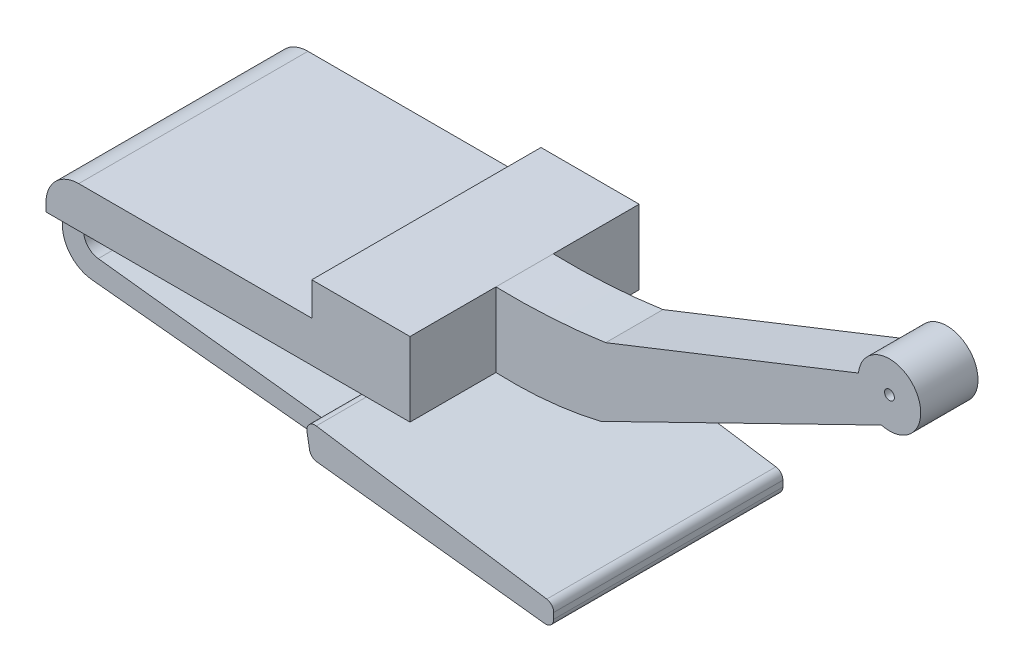
ISO-10303-21;
HEADER;
FILE_DESCRIPTION(('STEP AP214'),'2;1');
FILE_NAME('part.step','',(''),(''),'','','');
FILE_SCHEMA(('AUTOMOTIVE_DESIGN { 1 0 10303 214 1 1 1 1 }'));
ENDSEC;
DATA;
#1=APPLICATION_CONTEXT('core data for automotive mechanical design processes');
#2=APPLICATION_PROTOCOL_DEFINITION('international standard','automotive_design',2000,#1);
#3=PRODUCT_CONTEXT('',#1,'mechanical');
#4=PRODUCT('Part','Part','',(#3));
#5=PRODUCT_RELATED_PRODUCT_CATEGORY('part','',(#4));
#6=PRODUCT_DEFINITION_FORMATION('','',#4);
#7=PRODUCT_DEFINITION_CONTEXT('part definition',#1,'design');
#8=PRODUCT_DEFINITION('design','',#6,#7);
#9=PRODUCT_DEFINITION_SHAPE('','',#8);
#10=(LENGTH_UNIT() NAMED_UNIT(*) SI_UNIT(.MILLI.,.METRE.));
#11=(NAMED_UNIT(*) PLANE_ANGLE_UNIT() SI_UNIT($,.RADIAN.));
#12=(NAMED_UNIT(*) SI_UNIT($,.STERADIAN.) SOLID_ANGLE_UNIT());
#13=UNCERTAINTY_MEASURE_WITH_UNIT(LENGTH_MEASURE(1.E-05),#10,'distance_accuracy_value','');
#14=(GEOMETRIC_REPRESENTATION_CONTEXT(3) GLOBAL_UNCERTAINTY_ASSIGNED_CONTEXT((#13)) GLOBAL_UNIT_ASSIGNED_CONTEXT((#10,
#11,#12)) REPRESENTATION_CONTEXT('',''));
#15=CARTESIAN_POINT('',(0.,0.,0.));
#16=DIRECTION('',(0.,0.,1.));
#17=DIRECTION('',(1.,0.,0.));
#18=AXIS2_PLACEMENT_3D('',#15,#16,#17);
#19=CARTESIAN_POINT('',(9.1764705882353,3.85294117647059,7.));
#20=DIRECTION('',(-1.,0.,0.));
#21=DIRECTION('',(0.,0.,1.));
#22=AXIS2_PLACEMENT_3D('',#19,#20,#21);
#23=PLANE('',#22);
#24=DIRECTION('',(0.,-1.,0.));
#25=VECTOR('',#24,1.);
#26=CARTESIAN_POINT('',(9.1764705882353,8.38235294117648,1.75));
#27=LINE('',#26,#25);
#28=CARTESIAN_POINT('',(9.1764705882353,8.38235294117648,1.75));
#29=VERTEX_POINT('',#28);
#30=CARTESIAN_POINT('',(9.1764705882353,3.85294117647059,1.75));
#31=VERTEX_POINT('',#30);
#32=EDGE_CURVE('E246',#29,#31,#27,.T.);
#33=ORIENTED_EDGE('',*,*,#32,.F.);
#34=DIRECTION('',(0.,0.,-1.));
#35=VECTOR('',#34,1.);
#36=CARTESIAN_POINT('',(9.1764705882353,8.38235294117648,7.));
#37=LINE('',#36,#35);
#38=CARTESIAN_POINT('',(9.1764705882353,8.38235294117648,7.));
#39=VERTEX_POINT('',#38);
#40=EDGE_CURVE('E465',#39,#29,#37,.T.);
#41=ORIENTED_EDGE('',*,*,#40,.F.);
#42=DIRECTION('',(0.,1.,0.));
#43=VECTOR('',#42,1.);
#44=CARTESIAN_POINT('',(9.1764705882353,3.85294117647059,7.));
#45=LINE('',#44,#43);
#46=CARTESIAN_POINT('',(9.1764705882353,3.85294117647059,7.));
#47=VERTEX_POINT('',#46);
#48=EDGE_CURVE('E248',#47,#39,#45,.T.);
#49=ORIENTED_EDGE('',*,*,#48,.F.);
#50=DIRECTION('',(0.,0.,-1.));
#51=VECTOR('',#50,1.);
#52=CARTESIAN_POINT('',(9.1764705882353,3.85294117647059,7.));
#53=LINE('',#52,#51);
#54=EDGE_CURVE('E242',#47,#31,#53,.T.);
#55=ORIENTED_EDGE('',*,*,#54,.T.);
#56=EDGE_LOOP('',(#33,#41,#49,#55));
#57=FACE_BOUND('',#56,.T.);
#58=ADVANCED_FACE('F37',(#57),#23,.F.);
#59=CARTESIAN_POINT('',(-11.2605255667113,0.670651598769307,6.));
#60=DIRECTION('',(0.100851018649792,0.99490153886568,0.));
#61=DIRECTION('',(-0.994901538865681,0.100851018649792,0.));
#62=AXIS2_PLACEMENT_3D('',#59,#60,#61);
#63=PLANE('',#62);
#64=DIRECTION('',(0.,0.,-1.));
#65=VECTOR('',#64,1.);
#66=CARTESIAN_POINT('',(3.06996879819847,-0.781999641577588,7.));
#67=LINE('',#66,#65);
#68=CARTESIAN_POINT('',(3.06996879819847,-0.781999641577588,6.));
#69=VERTEX_POINT('',#68);
#70=CARTESIAN_POINT('',(3.06996879819847,-0.781999641577588,-6.));
#71=VERTEX_POINT('',#70);
#72=EDGE_CURVE('E432',#69,#71,#67,.T.);
#73=ORIENTED_EDGE('',*,*,#72,.F.);
#74=DIRECTION('',(0.994901538865681,-0.100851018649792,0.));
#75=VECTOR('',#74,1.);
#76=CARTESIAN_POINT('',(-11.2605255667113,0.670651598769307,6.));
#77=LINE('',#76,#75);
#78=CARTESIAN_POINT('',(-11.2605255667113,0.670651598769306,6.));
#79=VERTEX_POINT('',#78);
#80=EDGE_CURVE('E439',#79,#69,#77,.T.);
#81=ORIENTED_EDGE('',*,*,#80,.F.);
#82=DIRECTION('',(0.,0.,-1.));
#83=VECTOR('',#82,1.);
#84=CARTESIAN_POINT('',(-11.2605255667113,0.670651598769306,6.));
#85=LINE('',#84,#83);
#86=CARTESIAN_POINT('',(-11.2605255667113,0.670651598769306,-6.));
#87=VERTEX_POINT('',#86);
#88=EDGE_CURVE('E499',#79,#87,#85,.T.);
#89=ORIENTED_EDGE('',*,*,#88,.T.);
#90=DIRECTION('',(0.994901538865681,-0.100851018649792,0.));
#91=VECTOR('',#90,1.);
#92=CARTESIAN_POINT('',(-11.2605255667113,0.670651598769307,-6.));
#93=LINE('',#92,#91);
#94=EDGE_CURVE('E530',#87,#71,#93,.T.);
#95=ORIENTED_EDGE('',*,*,#94,.T.);
#96=EDGE_LOOP('',(#73,#81,#89,#95));
#97=FACE_BOUND('',#96,.T.);
#98=ADVANCED_FACE('F607',(#97),#63,.F.);
#99=CARTESIAN_POINT('',(3.07281024128905,0.357643738801673,6.));
#100=DIRECTION('',(-0.115751075665273,-0.993278253301829,0.));
#101=DIRECTION('',(0.993278253301829,-0.115751075665273,0.));
#102=AXIS2_PLACEMENT_3D('',#99,#100,#101);
#103=PLANE('',#102);
#104=DIRECTION('',(0.,0.,-1.));
#105=VECTOR('',#104,1.);
#106=CARTESIAN_POINT('',(2.88284537780646,0.379781178349577,7.));
#107=LINE('',#106,#105);
#108=CARTESIAN_POINT('',(2.88284537780646,0.379781178349577,-6.));
#109=VERTEX_POINT('',#108);
#110=CARTESIAN_POINT('',(2.88284537780646,0.379781178349577,6.));
#111=VERTEX_POINT('',#110);
#112=EDGE_CURVE('E428',#109,#111,#107,.F.);
#113=ORIENTED_EDGE('',*,*,#112,.F.);
#114=DIRECTION('',(-0.993278253301829,0.115751075665273,0.));
#115=VECTOR('',#114,1.);
#116=CARTESIAN_POINT('',(3.07281024128905,0.357643738801673,-6.));
#117=LINE('',#116,#115);
#118=CARTESIAN_POINT('',(-10.8683215416007,1.98226503147227,-6.));
#119=VERTEX_POINT('',#118);
#120=EDGE_CURVE('E536',#109,#119,#117,.T.);
#121=ORIENTED_EDGE('',*,*,#120,.T.);
#122=DIRECTION('',(0.,0.,-1.));
#123=VECTOR('',#122,1.);
#124=CARTESIAN_POINT('',(-10.8683215416007,1.98226503147227,6.));
#125=LINE('',#124,#123);
#126=CARTESIAN_POINT('',(-10.8683215416007,1.98226503147227,6.));
#127=VERTEX_POINT('',#126);
#128=EDGE_CURVE('E550',#127,#119,#125,.T.);
#129=ORIENTED_EDGE('',*,*,#128,.F.);
#130=DIRECTION('',(-0.993278253301829,0.115751075665273,0.));
#131=VECTOR('',#130,1.);
#132=CARTESIAN_POINT('',(3.07281024128905,0.357643738801673,6.));
#133=LINE('',#132,#131);
#134=EDGE_CURVE('E443',#111,#127,#133,.T.);
#135=ORIENTED_EDGE('',*,*,#134,.F.);
#136=EDGE_LOOP('',(#113,#121,#129,#135));
#137=FACE_BOUND('',#136,.T.);
#138=ADVANCED_FACE('F611',(#137),#103,.F.);
#139=CARTESIAN_POINT('',(-10.7525704659354,2.9755432847741,6.));
#140=DIRECTION('',(0.,0.,-1.));
#141=DIRECTION('',(-1.,0.,0.));
#142=AXIS2_PLACEMENT_3D('',#139,#140,#141);
#143=PLANE('',#142);
#144=CARTESIAN_POINT('',(3.53426539442417,-0.596449996648719,6.));
#145=DIRECTION('',(0.,0.,-1.));
#146=DIRECTION('',(-1.,0.,0.));
#147=AXIS2_PLACEMENT_3D('',#144,#145,#146);
#148=CIRCLE('',#147,0.5);
#149=CARTESIAN_POINT('',(3.04205160666993,-0.684345315890544,6.));
#150=VERTEX_POINT('',#149);
#151=EDGE_CURVE('E434',#150,#69,#148,.F.);
#152=ORIENTED_EDGE('',*,*,#151,.F.);
#153=DIRECTION('',(0.175790638483657,-0.984427575508482,0.));
#154=VECTOR('',#153,1.);
#155=CARTESIAN_POINT('',(1.98241012841508,5.24964696233667,6.));
#156=LINE('',#155,#154);
#157=CARTESIAN_POINT('',(2.88313142094607,0.205607724163092,6.));
#158=VERTEX_POINT('',#157);
#159=EDGE_CURVE('E426',#158,#150,#156,.T.);
#160=ORIENTED_EDGE('',*,*,#159,.F.);
#161=CARTESIAN_POINT('',(3.37534520870031,0.293503043404926,6.));
#162=DIRECTION('',(0.,0.,-1.));
#163=DIRECTION('',(-1.,0.,0.));
#164=AXIS2_PLACEMENT_3D('',#161,#162,#163);
#165=CIRCLE('',#164,0.5);
#166=EDGE_CURVE('E430',#111,#158,#165,.F.);
#167=ORIENTED_EDGE('',*,*,#166,.F.);
#168=ORIENTED_EDGE('',*,*,#134,.T.);
#169=CARTESIAN_POINT('',(-10.7525704659354,2.9755432847741,6.));
#170=DIRECTION('',(0.,0.,-1.));
#171=DIRECTION('',(-1.,0.,0.));
#172=AXIS2_PLACEMENT_3D('',#169,#170,#171);
#173=CIRCLE('',#172,1.);
#174=CARTESIAN_POINT('',(-11.7525704659354,2.97554328477411,6.));
#175=VERTEX_POINT('',#174);
#176=EDGE_CURVE('E445',#127,#175,#173,.T.);
#177=ORIENTED_EDGE('',*,*,#176,.T.);
#178=DIRECTION('',(0.,1.,0.));
#179=VECTOR('',#178,1.);
#180=CARTESIAN_POINT('',(-11.7525704659354,2.97554328477411,6.));
#181=LINE('',#180,#179);
#182=CARTESIAN_POINT('',(-11.7525704659354,3.85294117647059,6.));
#183=VERTEX_POINT('',#182);
#184=EDGE_CURVE('E447',#175,#183,#181,.T.);
#185=ORIENTED_EDGE('',*,*,#184,.T.);
#186=DIRECTION('',(-1.,0.,0.));
#187=VECTOR('',#186,1.);
#188=CARTESIAN_POINT('',(-13.0588235294118,3.85294117647059,6.));
#189=LINE('',#188,#187);
#190=CARTESIAN_POINT('',(-13.0588235294118,3.85294117647059,6.));
#191=VERTEX_POINT('',#190);
#192=EDGE_CURVE('E521',#183,#191,#189,.T.);
#193=ORIENTED_EDGE('',*,*,#192,.T.);
#194=DIRECTION('',(0.,-1.,0.));
#195=VECTOR('',#194,1.);
#196=CARTESIAN_POINT('',(-13.0588235294118,3.85294117647059,6.));
#197=LINE('',#196,#195);
#198=CARTESIAN_POINT('',(-13.0588235294118,2.66045467650068,6.));
#199=VERTEX_POINT('',#198);
#200=EDGE_CURVE('E440',#191,#199,#197,.T.);
#201=ORIENTED_EDGE('',*,*,#200,.T.);
#202=CARTESIAN_POINT('',(-11.0588235294118,2.66045467650067,6.));
#203=DIRECTION('',(0.,0.,1.));
#204=DIRECTION('',(-1.,0.,0.));
#205=AXIS2_PLACEMENT_3D('',#202,#203,#204);
#206=CIRCLE('',#205,2.);
#207=EDGE_CURVE('E437',#199,#79,#206,.T.);
#208=ORIENTED_EDGE('',*,*,#207,.T.);
#209=ORIENTED_EDGE('',*,*,#80,.T.);
#210=EDGE_LOOP('',(#152,#160,#167,#168,#177,#185,#193,#201,#208,#209));
#211=FACE_BOUND('',#210,.T.);
#212=ADVANCED_FACE('F624',(#211),#143,.F.);
#213=CARTESIAN_POINT('',(-10.7525704659354,2.9755432847741,-6.));
#214=DIRECTION('',(0.,0.,-1.));
#215=DIRECTION('',(-1.,0.,0.));
#216=AXIS2_PLACEMENT_3D('',#213,#214,#215);
#217=PLANE('',#216);
#218=DIRECTION('',(0.175790638483657,-0.984427575508482,0.));
#219=VECTOR('',#218,1.);
#220=CARTESIAN_POINT('',(1.98241012841508,5.24964696233667,-6.));
#221=LINE('',#220,#219);
#222=CARTESIAN_POINT('',(2.88313142094607,0.205607724163092,-6.));
#223=VERTEX_POINT('',#222);
#224=CARTESIAN_POINT('',(3.04205160666993,-0.684345315890545,-6.));
#225=VERTEX_POINT('',#224);
#226=EDGE_CURVE('E252',#223,#225,#221,.T.);
#227=ORIENTED_EDGE('',*,*,#226,.T.);
#228=CARTESIAN_POINT('',(3.53426539442417,-0.596449996648719,-6.));
#229=DIRECTION('',(0.,0.,-1.));
#230=DIRECTION('',(-1.,0.,0.));
#231=AXIS2_PLACEMENT_3D('',#228,#229,#230);
#232=CIRCLE('',#231,0.5);
#233=EDGE_CURVE('E11',#225,#71,#232,.F.);
#234=ORIENTED_EDGE('',*,*,#233,.T.);
#235=ORIENTED_EDGE('',*,*,#94,.F.);
#236=CARTESIAN_POINT('',(-11.0588235294118,2.66045467650067,-6.));
#237=DIRECTION('',(0.,0.,1.));
#238=DIRECTION('',(-1.,0.,0.));
#239=AXIS2_PLACEMENT_3D('',#236,#237,#238);
#240=CIRCLE('',#239,2.);
#241=CARTESIAN_POINT('',(-13.0588235294118,2.66045467650068,-6.));
#242=VERTEX_POINT('',#241);
#243=EDGE_CURVE('E452',#242,#87,#240,.T.);
#244=ORIENTED_EDGE('',*,*,#243,.F.);
#245=DIRECTION('',(0.,-1.,0.));
#246=VECTOR('',#245,1.);
#247=CARTESIAN_POINT('',(-13.0588235294118,3.85294117647059,-6.));
#248=LINE('',#247,#246);
#249=CARTESIAN_POINT('',(-13.0588235294118,3.85294117647059,-6.));
#250=VERTEX_POINT('',#249);
#251=EDGE_CURVE('E458',#250,#242,#248,.T.);
#252=ORIENTED_EDGE('',*,*,#251,.F.);
#253=DIRECTION('',(-1.,0.,0.));
#254=VECTOR('',#253,1.);
#255=CARTESIAN_POINT('',(-13.0588235294118,3.85294117647059,-6.));
#256=LINE('',#255,#254);
#257=CARTESIAN_POINT('',(-11.7525704659354,3.85294117647059,-6.));
#258=VERTEX_POINT('',#257);
#259=EDGE_CURVE('E436',#258,#250,#256,.T.);
#260=ORIENTED_EDGE('',*,*,#259,.F.);
#261=DIRECTION('',(0.,1.,0.));
#262=VECTOR('',#261,1.);
#263=CARTESIAN_POINT('',(-11.7525704659354,2.97554328477411,-6.));
#264=LINE('',#263,#262);
#265=CARTESIAN_POINT('',(-11.7525704659354,2.97554328477411,-6.));
#266=VERTEX_POINT('',#265);
#267=EDGE_CURVE('E526',#266,#258,#264,.T.);
#268=ORIENTED_EDGE('',*,*,#267,.F.);
#269=CARTESIAN_POINT('',(-10.7525704659354,2.9755432847741,-6.));
#270=DIRECTION('',(0.,0.,-1.));
#271=DIRECTION('',(-1.,0.,0.));
#272=AXIS2_PLACEMENT_3D('',#269,#270,#271);
#273=CIRCLE('',#272,1.);
#274=EDGE_CURVE('E540',#119,#266,#273,.T.);
#275=ORIENTED_EDGE('',*,*,#274,.F.);
#276=ORIENTED_EDGE('',*,*,#120,.F.);
#277=CARTESIAN_POINT('',(3.37534520870031,0.293503043404926,-6.));
#278=DIRECTION('',(0.,0.,-1.));
#279=DIRECTION('',(-1.,0.,0.));
#280=AXIS2_PLACEMENT_3D('',#277,#278,#279);
#281=CIRCLE('',#280,0.5);
#282=EDGE_CURVE('E48',#109,#223,#281,.F.);
#283=ORIENTED_EDGE('',*,*,#282,.T.);
#284=EDGE_LOOP('',(#227,#234,#235,#244,#252,#260,#268,#275,#276,#283));
#285=FACE_BOUND('',#284,.T.);
#286=ADVANCED_FACE('F620',(#285),#217,.T.);
#287=CARTESIAN_POINT('',(-13.0588235294118,3.85294117647059,7.));
#288=DIRECTION('',(0.,1.,0.));
#289=DIRECTION('',(0.,0.,1.));
#290=AXIS2_PLACEMENT_3D('',#287,#288,#289);
#291=PLANE('',#290);
#292=DIRECTION('',(0.,0.,-1.));
#293=VECTOR('',#292,1.);
#294=CARTESIAN_POINT('',(-11.7525704659354,3.85294117647059,6.));
#295=LINE('',#294,#293);
#296=EDGE_CURVE('E449',#183,#258,#295,.T.);
#297=ORIENTED_EDGE('',*,*,#296,.T.);
#298=ORIENTED_EDGE('',*,*,#259,.T.);
#299=DIRECTION('',(0.,0.,-1.));
#300=VECTOR('',#299,1.);
#301=CARTESIAN_POINT('',(-13.0588235294118,3.85294117647059,7.));
#302=LINE('',#301,#300);
#303=CARTESIAN_POINT('',(-13.0588235294118,3.85294117647059,-7.));
#304=VERTEX_POINT('',#303);
#305=EDGE_CURVE('E494',#250,#304,#302,.T.);
#306=ORIENTED_EDGE('',*,*,#305,.T.);
#307=DIRECTION('',(1.,0.,0.));
#308=VECTOR('',#307,1.);
#309=CARTESIAN_POINT('',(-13.0588235294118,3.85294117647059,-7.));
#310=LINE('',#309,#308);
#311=CARTESIAN_POINT('',(9.1764705882353,3.85294117647059,-7.));
#312=VERTEX_POINT('',#311);
#313=EDGE_CURVE('E489',#304,#312,#310,.T.);
#314=ORIENTED_EDGE('',*,*,#313,.T.);
#315=CARTESIAN_POINT('',(9.1764705882353,3.85294117647059,-1.75));
#316=VERTEX_POINT('',#315);
#317=EDGE_CURVE('E253',#316,#312,#53,.T.);
#318=ORIENTED_EDGE('',*,*,#317,.F.);
#319=DIRECTION('',(0.,0.,-1.));
#320=VECTOR('',#319,1.);
#321=CARTESIAN_POINT('',(9.1764705882353,3.85294117647059,1.75));
#322=LINE('',#321,#320);
#323=EDGE_CURVE('E256',#31,#316,#322,.T.);
#324=ORIENTED_EDGE('',*,*,#323,.F.);
#325=ORIENTED_EDGE('',*,*,#54,.F.);
#326=DIRECTION('',(1.,0.,0.));
#327=VECTOR('',#326,1.);
#328=CARTESIAN_POINT('',(-13.0588235294118,3.85294117647059,7.));
#329=LINE('',#328,#327);
#330=CARTESIAN_POINT('',(-13.0588235294118,3.85294117647059,7.));
#331=VERTEX_POINT('',#330);
#332=EDGE_CURVE('E513',#331,#47,#329,.T.);
#333=ORIENTED_EDGE('',*,*,#332,.F.);
#334=EDGE_CURVE('E476',#331,#191,#302,.T.);
#335=ORIENTED_EDGE('',*,*,#334,.T.);
#336=ORIENTED_EDGE('',*,*,#192,.F.);
#337=EDGE_LOOP('',(#297,#298,#306,#314,#318,#324,#325,#333,#335,#336));
#338=FACE_BOUND('',#337,.T.);
#339=ADVANCED_FACE('F39',(#338),#291,.F.);
#340=CARTESIAN_POINT('',(9.1764705882353,8.38235294117648,-1.75));
#341=VERTEX_POINT('',#340);
#342=CARTESIAN_POINT('',(9.1764705882353,8.38235294117648,-7.));
#343=VERTEX_POINT('',#342);
#344=EDGE_CURVE('E61',#341,#343,#37,.T.);
#345=ORIENTED_EDGE('',*,*,#344,.F.);
#346=DIRECTION('',(0.,-1.,0.));
#347=VECTOR('',#346,1.);
#348=CARTESIAN_POINT('',(9.1764705882353,8.38235294117648,-1.75));
#349=LINE('',#348,#347);
#350=EDGE_CURVE('E56',#341,#316,#349,.T.);
#351=ORIENTED_EDGE('',*,*,#350,.T.);
#352=ORIENTED_EDGE('',*,*,#317,.T.);
#353=DIRECTION('',(0.,1.,0.));
#354=VECTOR('',#353,1.);
#355=CARTESIAN_POINT('',(9.1764705882353,3.85294117647059,-7.));
#356=LINE('',#355,#354);
#357=EDGE_CURVE('E483',#312,#343,#356,.T.);
#358=ORIENTED_EDGE('',*,*,#357,.T.);
#359=EDGE_LOOP('',(#345,#351,#352,#358));
#360=FACE_BOUND('',#359,.T.);
#361=ADVANCED_FACE('F482',(#360),#23,.F.);
#362=CARTESIAN_POINT('',(9.1764705882353,8.38235294117648,7.));
#363=DIRECTION('',(0.,-1.,0.));
#364=DIRECTION('',(0.,0.,-1.));
#365=AXIS2_PLACEMENT_3D('',#362,#363,#364);
#366=PLANE('',#365);
#367=DIRECTION('',(-1.,0.,0.));
#368=VECTOR('',#367,1.);
#369=CARTESIAN_POINT('',(9.1764705882353,8.38235294117648,-7.));
#370=LINE('',#369,#368);
#371=CARTESIAN_POINT('',(3.1764705882353,8.38235294117648,-7.));
#372=VERTEX_POINT('',#371);
#373=EDGE_CURVE('E491',#343,#372,#370,.T.);
#374=ORIENTED_EDGE('',*,*,#373,.T.);
#375=DIRECTION('',(0.,0.,-1.));
#376=VECTOR('',#375,1.);
#377=CARTESIAN_POINT('',(3.1764705882353,8.38235294117648,7.));
#378=LINE('',#377,#376);
#379=CARTESIAN_POINT('',(3.1764705882353,8.38235294117648,7.));
#380=VERTEX_POINT('',#379);
#381=EDGE_CURVE('E471',#380,#372,#378,.T.);
#382=ORIENTED_EDGE('',*,*,#381,.F.);
#383=DIRECTION('',(-1.,0.,0.));
#384=VECTOR('',#383,1.);
#385=CARTESIAN_POINT('',(9.1764705882353,8.38235294117648,7.));
#386=LINE('',#385,#384);
#387=EDGE_CURVE('E556',#39,#380,#386,.T.);
#388=ORIENTED_EDGE('',*,*,#387,.F.);
#389=ORIENTED_EDGE('',*,*,#40,.T.);
#390=DIRECTION('',(0.,0.,-1.));
#391=VECTOR('',#390,1.);
#392=CARTESIAN_POINT('',(9.1764705882353,8.38235294117648,1.75));
#393=LINE('',#392,#391);
#394=EDGE_CURVE('E262',#29,#341,#393,.T.);
#395=ORIENTED_EDGE('',*,*,#394,.T.);
#396=ORIENTED_EDGE('',*,*,#344,.T.);
#397=EDGE_LOOP('',(#374,#382,#388,#389,#395,#396));
#398=FACE_BOUND('',#397,.T.);
#399=ADVANCED_FACE('F588',(#398),#366,.F.);
#400=CARTESIAN_POINT('',(3.1764705882353,8.38235294117648,7.));
#401=DIRECTION('',(1.,0.,0.));
#402=DIRECTION('',(0.,0.,-1.));
#403=AXIS2_PLACEMENT_3D('',#400,#401,#402);
#404=PLANE('',#403);
#405=DIRECTION('',(0.,-1.,0.));
#406=VECTOR('',#405,1.);
#407=CARTESIAN_POINT('',(3.1764705882353,8.38235294117648,-7.));
#408=LINE('',#407,#406);
#409=CARTESIAN_POINT('',(3.1764705882353,6.35294117647059,-7.));
#410=VERTEX_POINT('',#409);
#411=EDGE_CURVE('E506',#372,#410,#408,.T.);
#412=ORIENTED_EDGE('',*,*,#411,.T.);
#413=DIRECTION('',(0.,0.,-1.));
#414=VECTOR('',#413,1.);
#415=CARTESIAN_POINT('',(3.1764705882353,6.35294117647059,7.));
#416=LINE('',#415,#414);
#417=CARTESIAN_POINT('',(3.1764705882353,6.35294117647059,7.));
#418=VERTEX_POINT('',#417);
#419=EDGE_CURVE('E574',#418,#410,#416,.T.);
#420=ORIENTED_EDGE('',*,*,#419,.F.);
#421=DIRECTION('',(0.,-1.,0.));
#422=VECTOR('',#421,1.);
#423=CARTESIAN_POINT('',(3.1764705882353,8.38235294117648,7.));
#424=LINE('',#423,#422);
#425=EDGE_CURVE('E558',#380,#418,#424,.T.);
#426=ORIENTED_EDGE('',*,*,#425,.F.);
#427=ORIENTED_EDGE('',*,*,#381,.T.);
#428=EDGE_LOOP('',(#412,#420,#426,#427));
#429=FACE_BOUND('',#428,.T.);
#430=ADVANCED_FACE('F619',(#429),#404,.F.);
#431=CARTESIAN_POINT('',(3.1764705882353,6.35294117647059,7.));
#432=DIRECTION('',(0.,-1.,0.));
#433=DIRECTION('',(0.,0.,-1.));
#434=AXIS2_PLACEMENT_3D('',#431,#432,#433);
#435=PLANE('',#434);
#436=DIRECTION('',(-1.,0.,0.));
#437=VECTOR('',#436,1.);
#438=CARTESIAN_POINT('',(3.1764705882353,6.35294117647059,-7.));
#439=LINE('',#438,#437);
#440=CARTESIAN_POINT('',(-11.0588235294117,6.35294117647059,-7.));
#441=VERTEX_POINT('',#440);
#442=EDGE_CURVE('E508',#410,#441,#439,.T.);
#443=ORIENTED_EDGE('',*,*,#442,.T.);
#444=DIRECTION('',(0.,0.,-1.));
#445=VECTOR('',#444,1.);
#446=CARTESIAN_POINT('',(-11.0588235294117,6.35294117647059,7.));
#447=LINE('',#446,#445);
#448=CARTESIAN_POINT('',(-11.0588235294117,6.35294117647059,7.));
#449=VERTEX_POINT('',#448);
#450=EDGE_CURVE('E572',#449,#441,#447,.T.);
#451=ORIENTED_EDGE('',*,*,#450,.F.);
#452=DIRECTION('',(-1.,0.,0.));
#453=VECTOR('',#452,1.);
#454=CARTESIAN_POINT('',(3.1764705882353,6.35294117647059,7.));
#455=LINE('',#454,#453);
#456=EDGE_CURVE('E560',#418,#449,#455,.T.);
#457=ORIENTED_EDGE('',*,*,#456,.F.);
#458=ORIENTED_EDGE('',*,*,#419,.T.);
#459=EDGE_LOOP('',(#443,#451,#457,#458));
#460=FACE_BOUND('',#459,.T.);
#461=ADVANCED_FACE('F658',(#460),#435,.F.);
#462=CARTESIAN_POINT('',(-11.0588235294118,4.35294117647059,7.));
#463=DIRECTION('',(0.,0.,-1.));
#464=DIRECTION('',(-1.,0.,0.));
#465=AXIS2_PLACEMENT_3D('',#462,#463,#464);
#466=CYLINDRICAL_SURFACE('',#465,2.);
#467=CARTESIAN_POINT('',(-11.0588235294118,4.35294117647059,-7.));
#468=DIRECTION('',(0.,0.,1.));
#469=DIRECTION('',(-1.,0.,0.));
#470=AXIS2_PLACEMENT_3D('',#467,#468,#469);
#471=CIRCLE('',#470,2.);
#472=CARTESIAN_POINT('',(-13.0588235294118,4.35294117647058,-7.));
#473=VERTEX_POINT('',#472);
#474=EDGE_CURVE('E510',#441,#473,#471,.T.);
#475=ORIENTED_EDGE('',*,*,#474,.T.);
#476=DIRECTION('',(0.,0.,-1.));
#477=VECTOR('',#476,1.);
#478=CARTESIAN_POINT('',(-13.0588235294118,4.35294117647058,7.));
#479=LINE('',#478,#477);
#480=CARTESIAN_POINT('',(-13.0588235294118,4.35294117647058,7.));
#481=VERTEX_POINT('',#480);
#482=EDGE_CURVE('E516',#481,#473,#479,.T.);
#483=ORIENTED_EDGE('',*,*,#482,.F.);
#484=CARTESIAN_POINT('',(-11.0588235294118,4.35294117647059,7.));
#485=DIRECTION('',(0.,0.,1.));
#486=DIRECTION('',(-1.,0.,0.));
#487=AXIS2_PLACEMENT_3D('',#484,#485,#486);
#488=CIRCLE('',#487,2.);
#489=EDGE_CURVE('E561',#449,#481,#488,.T.);
#490=ORIENTED_EDGE('',*,*,#489,.F.);
#491=ORIENTED_EDGE('',*,*,#450,.T.);
#492=EDGE_LOOP('',(#475,#483,#490,#491));
#493=FACE_BOUND('',#492,.T.);
#494=ADVANCED_FACE('F655',(#493),#466,.T.);
#495=CARTESIAN_POINT('',(-13.0588235294118,4.35294117647058,7.));
#496=DIRECTION('',(1.,0.,0.));
#497=DIRECTION('',(0.,0.,-1.));
#498=AXIS2_PLACEMENT_3D('',#495,#496,#497);
#499=PLANE('',#498);
#500=DIRECTION('',(0.,-1.,0.));
#501=VECTOR('',#500,1.);
#502=CARTESIAN_POINT('',(-13.0588235294118,4.35294117647058,-7.));
#503=LINE('',#502,#501);
#504=EDGE_CURVE('E512',#473,#304,#503,.T.);
#505=ORIENTED_EDGE('',*,*,#504,.T.);
#506=ORIENTED_EDGE('',*,*,#305,.F.);
#507=ORIENTED_EDGE('',*,*,#251,.T.);
#508=DIRECTION('',(0.,0.,-1.));
#509=VECTOR('',#508,1.);
#510=CARTESIAN_POINT('',(-13.0588235294118,2.66045467650068,6.));
#511=LINE('',#510,#509);
#512=EDGE_CURVE('E496',#199,#242,#511,.T.);
#513=ORIENTED_EDGE('',*,*,#512,.F.);
#514=ORIENTED_EDGE('',*,*,#200,.F.);
#515=ORIENTED_EDGE('',*,*,#334,.F.);
#516=DIRECTION('',(0.,-1.,0.));
#517=VECTOR('',#516,1.);
#518=CARTESIAN_POINT('',(-13.0588235294118,4.35294117647058,7.));
#519=LINE('',#518,#517);
#520=EDGE_CURVE('E502',#481,#331,#519,.T.);
#521=ORIENTED_EDGE('',*,*,#520,.F.);
#522=ORIENTED_EDGE('',*,*,#482,.T.);
#523=EDGE_LOOP('',(#505,#506,#507,#513,#514,#515,#521,#522));
#524=FACE_BOUND('',#523,.T.);
#525=ADVANCED_FACE('F570',(#524),#499,.F.);
#526=CARTESIAN_POINT('',(-11.0588235294118,4.35294117647059,7.));
#527=DIRECTION('',(0.,0.,-1.));
#528=DIRECTION('',(-1.,0.,0.));
#529=AXIS2_PLACEMENT_3D('',#526,#527,#528);
#530=PLANE('',#529);
#531=ORIENTED_EDGE('',*,*,#332,.T.);
#532=ORIENTED_EDGE('',*,*,#48,.T.);
#533=ORIENTED_EDGE('',*,*,#387,.T.);
#534=ORIENTED_EDGE('',*,*,#425,.T.);
#535=ORIENTED_EDGE('',*,*,#456,.T.);
#536=ORIENTED_EDGE('',*,*,#489,.T.);
#537=ORIENTED_EDGE('',*,*,#520,.T.);
#538=EDGE_LOOP('',(#531,#532,#533,#534,#535,#536,#537));
#539=FACE_BOUND('',#538,.T.);
#540=ADVANCED_FACE('F567',(#539),#530,.F.);
#541=CARTESIAN_POINT('',(-11.0588235294118,4.35294117647059,-7.));
#542=DIRECTION('',(0.,0.,-1.));
#543=DIRECTION('',(-1.,0.,0.));
#544=AXIS2_PLACEMENT_3D('',#541,#542,#543);
#545=PLANE('',#544);
#546=ORIENTED_EDGE('',*,*,#313,.F.);
#547=ORIENTED_EDGE('',*,*,#504,.F.);
#548=ORIENTED_EDGE('',*,*,#474,.F.);
#549=ORIENTED_EDGE('',*,*,#442,.F.);
#550=ORIENTED_EDGE('',*,*,#411,.F.);
#551=ORIENTED_EDGE('',*,*,#373,.F.);
#552=ORIENTED_EDGE('',*,*,#357,.F.);
#553=EDGE_LOOP('',(#546,#547,#548,#549,#550,#551,#552));
#554=FACE_BOUND('',#553,.T.);
#555=ADVANCED_FACE('F487',(#554),#545,.T.);
#556=CARTESIAN_POINT('',(-11.0588235294118,2.66045467650067,6.));
#557=DIRECTION('',(0.,0.,-1.));
#558=DIRECTION('',(-1.,0.,0.));
#559=AXIS2_PLACEMENT_3D('',#556,#557,#558);
#560=CYLINDRICAL_SURFACE('',#559,2.);
#561=ORIENTED_EDGE('',*,*,#243,.T.);
#562=ORIENTED_EDGE('',*,*,#88,.F.);
#563=ORIENTED_EDGE('',*,*,#207,.F.);
#564=ORIENTED_EDGE('',*,*,#512,.T.);
#565=EDGE_LOOP('',(#561,#562,#563,#564));
#566=FACE_BOUND('',#565,.T.);
#567=ADVANCED_FACE('F642',(#566),#560,.T.);
#568=CARTESIAN_POINT('',(-10.7525704659354,2.9755432847741,6.));
#569=DIRECTION('',(0.,0.,-1.));
#570=DIRECTION('',(-1.,0.,0.));
#571=AXIS2_PLACEMENT_3D('',#568,#569,#570);
#572=CYLINDRICAL_SURFACE('',#571,1.);
#573=ORIENTED_EDGE('',*,*,#274,.T.);
#574=DIRECTION('',(0.,0.,-1.));
#575=VECTOR('',#574,1.);
#576=CARTESIAN_POINT('',(-11.7525704659354,2.97554328477411,6.));
#577=LINE('',#576,#575);
#578=EDGE_CURVE('E547',#175,#266,#577,.T.);
#579=ORIENTED_EDGE('',*,*,#578,.F.);
#580=ORIENTED_EDGE('',*,*,#176,.F.);
#581=ORIENTED_EDGE('',*,*,#128,.T.);
#582=EDGE_LOOP('',(#573,#579,#580,#581));
#583=FACE_BOUND('',#582,.T.);
#584=ADVANCED_FACE('F638',(#583),#572,.F.);
#585=CARTESIAN_POINT('',(-11.7525704659354,2.97554328477411,6.));
#586=DIRECTION('',(-1.,0.,0.));
#587=DIRECTION('',(0.,0.,1.));
#588=AXIS2_PLACEMENT_3D('',#585,#586,#587);
#589=PLANE('',#588);
#590=ORIENTED_EDGE('',*,*,#267,.T.);
#591=ORIENTED_EDGE('',*,*,#296,.F.);
#592=ORIENTED_EDGE('',*,*,#184,.F.);
#593=ORIENTED_EDGE('',*,*,#578,.T.);
#594=EDGE_LOOP('',(#590,#591,#592,#593));
#595=FACE_BOUND('',#594,.T.);
#596=ADVANCED_FACE('F634',(#595),#589,.F.);
#597=CARTESIAN_POINT('',(3.53426539442417,-0.596449996648719,7.));
#598=DIRECTION('',(0.,0.,-1.));
#599=DIRECTION('',(-1.,0.,0.));
#600=AXIS2_PLACEMENT_3D('',#597,#598,#599);
#601=CYLINDRICAL_SURFACE('',#600,0.5);
#602=DIRECTION('',(0.,0.,-1.));
#603=VECTOR('',#602,1.);
#604=CARTESIAN_POINT('',(3.04205160666993,-0.684345315890544,7.));
#605=LINE('',#604,#603);
#606=CARTESIAN_POINT('',(3.04205160666993,-0.684345315890544,7.));
#607=VERTEX_POINT('',#606);
#608=EDGE_CURVE('E401',#607,#150,#605,.T.);
#609=ORIENTED_EDGE('',*,*,#608,.T.);
#610=ORIENTED_EDGE('',*,*,#151,.T.);
#611=ORIENTED_EDGE('',*,*,#72,.T.);
#612=ORIENTED_EDGE('',*,*,#233,.F.);
#613=CARTESIAN_POINT('',(3.04205160666993,-0.684345315890544,-7.));
#614=VERTEX_POINT('',#613);
#615=EDGE_CURVE('E382',#225,#614,#605,.T.);
#616=ORIENTED_EDGE('',*,*,#615,.T.);
#617=CARTESIAN_POINT('',(3.53426539442417,-0.596449996648719,-7.));
#618=DIRECTION('',(0.,0.,1.));
#619=DIRECTION('',(1.,0.,0.));
#620=AXIS2_PLACEMENT_3D('',#617,#618,#619);
#621=CIRCLE('',#620,0.5);
#622=CARTESIAN_POINT('',(3.4773938989133,-1.09320510029473,-7.));
#623=VERTEX_POINT('',#622);
#624=EDGE_CURVE('E383',#614,#623,#621,.T.);
#625=ORIENTED_EDGE('',*,*,#624,.T.);
#626=DIRECTION('',(0.,0.,-1.));
#627=VECTOR('',#626,1.);
#628=CARTESIAN_POINT('',(3.4773938989133,-1.09320510029473,7.));
#629=LINE('',#628,#627);
#630=CARTESIAN_POINT('',(3.4773938989133,-1.09320510029473,7.));
#631=VERTEX_POINT('',#630);
#632=EDGE_CURVE('E423',#631,#623,#629,.T.);
#633=ORIENTED_EDGE('',*,*,#632,.F.);
#634=CARTESIAN_POINT('',(3.53426539442417,-0.596449996648719,7.));
#635=DIRECTION('',(0.,0.,1.));
#636=DIRECTION('',(1.,0.,0.));
#637=AXIS2_PLACEMENT_3D('',#634,#635,#636);
#638=CIRCLE('',#637,0.5);
#639=EDGE_CURVE('E364',#607,#631,#638,.T.);
#640=ORIENTED_EDGE('',*,*,#639,.F.);
#641=EDGE_LOOP('',(#609,#610,#611,#612,#616,#625,#633,#640));
#642=FACE_BOUND('',#641,.T.);
#643=ADVANCED_FACE('F637',(#642),#601,.T.);
#644=CARTESIAN_POINT('',(3.37534520870031,0.293503043404926,7.));
#645=DIRECTION('',(0.,0.,-1.));
#646=DIRECTION('',(-1.,0.,0.));
#647=AXIS2_PLACEMENT_3D('',#644,#645,#646);
#648=CYLINDRICAL_SURFACE('',#647,0.5);
#649=ORIENTED_EDGE('',*,*,#112,.T.);
#650=ORIENTED_EDGE('',*,*,#166,.T.);
#651=DIRECTION('',(0.,0.,-1.));
#652=VECTOR('',#651,1.);
#653=CARTESIAN_POINT('',(2.88313142094607,0.205607724163092,7.));
#654=LINE('',#653,#652);
#655=CARTESIAN_POINT('',(2.88313142094607,0.205607724163092,7.));
#656=VERTEX_POINT('',#655);
#657=EDGE_CURVE('E405',#656,#158,#654,.T.);
#658=ORIENTED_EDGE('',*,*,#657,.F.);
#659=CARTESIAN_POINT('',(3.37534520870031,0.293503043404926,7.));
#660=DIRECTION('',(0.,0.,1.));
#661=DIRECTION('',(-1.,0.,0.));
#662=AXIS2_PLACEMENT_3D('',#659,#660,#661);
#663=CIRCLE('',#662,0.5);
#664=CARTESIAN_POINT('',(3.44984660946296,0.7879214302843,7.));
#665=VERTEX_POINT('',#664);
#666=EDGE_CURVE('E378',#665,#656,#663,.T.);
#667=ORIENTED_EDGE('',*,*,#666,.F.);
#668=DIRECTION('',(0.,0.,-1.));
#669=VECTOR('',#668,1.);
#670=CARTESIAN_POINT('',(3.44984660946296,0.7879214302843,7.));
#671=LINE('',#670,#669);
#672=CARTESIAN_POINT('',(3.44984660946296,0.7879214302843,-7.));
#673=VERTEX_POINT('',#672);
#674=EDGE_CURVE('E408',#665,#673,#671,.T.);
#675=ORIENTED_EDGE('',*,*,#674,.T.);
#676=CARTESIAN_POINT('',(3.37534520870031,0.293503043404926,-7.));
#677=DIRECTION('',(0.,0.,1.));
#678=DIRECTION('',(-1.,0.,0.));
#679=AXIS2_PLACEMENT_3D('',#676,#677,#678);
#680=CIRCLE('',#679,0.5);
#681=CARTESIAN_POINT('',(2.88313142094607,0.205607724163092,-7.));
#682=VERTEX_POINT('',#681);
#683=EDGE_CURVE('E396',#673,#682,#680,.T.);
#684=ORIENTED_EDGE('',*,*,#683,.T.);
#685=EDGE_CURVE('E404',#223,#682,#654,.T.);
#686=ORIENTED_EDGE('',*,*,#685,.F.);
#687=ORIENTED_EDGE('',*,*,#282,.F.);
#688=EDGE_LOOP('',(#649,#650,#658,#667,#675,#684,#686,#687));
#689=FACE_BOUND('',#688,.T.);
#690=ADVANCED_FACE('F705',(#689),#648,.T.);
#691=CARTESIAN_POINT('',(2.88313142094607,0.205607724163092,7.));
#692=DIRECTION('',(0.984427575508482,0.175790638483657,0.));
#693=DIRECTION('',(-0.175790638483657,0.984427575508482,0.));
#694=AXIS2_PLACEMENT_3D('',#691,#692,#693);
#695=PLANE('',#694);
#696=ORIENTED_EDGE('',*,*,#657,.T.);
#697=ORIENTED_EDGE('',*,*,#159,.T.);
#698=ORIENTED_EDGE('',*,*,#608,.F.);
#699=DIRECTION('',(0.175790638483657,-0.984427575508482,0.));
#700=VECTOR('',#699,1.);
#701=CARTESIAN_POINT('',(2.88313142094607,0.205607724163092,7.));
#702=LINE('',#701,#700);
#703=EDGE_CURVE('E380',#656,#607,#702,.T.);
#704=ORIENTED_EDGE('',*,*,#703,.F.);
#705=EDGE_LOOP('',(#696,#697,#698,#704));
#706=FACE_BOUND('',#705,.T.);
#707=ADVANCED_FACE('F712',(#706),#695,.F.);
#708=CARTESIAN_POINT('',(3.4773938989133,-1.09320510029473,7.));
#709=DIRECTION('',(0.113742991021749,0.993510207292017,0.));
#710=DIRECTION('',(-0.993510207292017,0.113742991021749,0.));
#711=AXIS2_PLACEMENT_3D('',#708,#709,#710);
#712=PLANE('',#711);
#713=DIRECTION('',(0.993510207292017,-0.113742991021749,0.));
#714=VECTOR('',#713,1.);
#715=CARTESIAN_POINT('',(3.4773938989133,-1.09320510029473,-7.));
#716=LINE('',#715,#714);
#717=CARTESIAN_POINT('',(17.3979324917773,-2.68691162144037,-7.));
#718=VERTEX_POINT('',#717);
#719=EDGE_CURVE('E386',#623,#718,#716,.T.);
#720=ORIENTED_EDGE('',*,*,#719,.T.);
#721=DIRECTION('',(0.,0.,-1.));
#722=VECTOR('',#721,1.);
#723=CARTESIAN_POINT('',(17.3979324917773,-2.68691162144037,7.));
#724=LINE('',#723,#722);
#725=CARTESIAN_POINT('',(17.3979324917773,-2.68691162144037,7.));
#726=VERTEX_POINT('',#725);
#727=EDGE_CURVE('E420',#726,#718,#724,.T.);
#728=ORIENTED_EDGE('',*,*,#727,.F.);
#729=DIRECTION('',(0.993510207292017,-0.113742991021749,0.));
#730=VECTOR('',#729,1.);
#731=CARTESIAN_POINT('',(3.4773938989133,-1.09320510029473,7.));
#732=LINE('',#731,#730);
#733=EDGE_CURVE('E367',#631,#726,#732,.T.);
#734=ORIENTED_EDGE('',*,*,#733,.F.);
#735=ORIENTED_EDGE('',*,*,#632,.T.);
#736=EDGE_LOOP('',(#720,#728,#734,#735));
#737=FACE_BOUND('',#736,.T.);
#738=ADVANCED_FACE('F720',(#737),#712,.F.);
#739=CARTESIAN_POINT('',(17.4548039872882,-2.19015651779436,7.));
#740=DIRECTION('',(0.,0.,-1.));
#741=DIRECTION('',(-1.,0.,0.));
#742=AXIS2_PLACEMENT_3D('',#739,#740,#741);
#743=CYLINDRICAL_SURFACE('',#742,0.5);
#744=CARTESIAN_POINT('',(17.4548039872882,-2.19015651779436,-7.));
#745=DIRECTION('',(0.,0.,1.));
#746=DIRECTION('',(1.,0.,0.));
#747=AXIS2_PLACEMENT_3D('',#744,#745,#746);
#748=CIRCLE('',#747,0.5);
#749=CARTESIAN_POINT('',(17.9548039872882,-2.19015651779436,-7.));
#750=VERTEX_POINT('',#749);
#751=EDGE_CURVE('E388',#718,#750,#748,.T.);
#752=ORIENTED_EDGE('',*,*,#751,.T.);
#753=DIRECTION('',(0.,0.,-1.));
#754=VECTOR('',#753,1.);
#755=CARTESIAN_POINT('',(17.9548039872882,-2.19015651779436,7.));
#756=LINE('',#755,#754);
#757=CARTESIAN_POINT('',(17.9548039872882,-2.19015651779436,7.));
#758=VERTEX_POINT('',#757);
#759=EDGE_CURVE('E417',#758,#750,#756,.T.);
#760=ORIENTED_EDGE('',*,*,#759,.F.);
#761=CARTESIAN_POINT('',(17.4548039872882,-2.19015651779436,7.));
#762=DIRECTION('',(0.,0.,1.));
#763=DIRECTION('',(1.,0.,0.));
#764=AXIS2_PLACEMENT_3D('',#761,#762,#763);
#765=CIRCLE('',#764,0.5);
#766=EDGE_CURVE('E370',#726,#758,#765,.T.);
#767=ORIENTED_EDGE('',*,*,#766,.F.);
#768=ORIENTED_EDGE('',*,*,#727,.T.);
#769=EDGE_LOOP('',(#752,#760,#767,#768));
#770=FACE_BOUND('',#769,.T.);
#771=ADVANCED_FACE('F729',(#770),#743,.T.);
#772=CARTESIAN_POINT('',(17.9548039872882,-2.19015651779436,7.));
#773=DIRECTION('',(-1.,0.,0.));
#774=DIRECTION('',(0.,0.,1.));
#775=AXIS2_PLACEMENT_3D('',#772,#773,#774);
#776=PLANE('',#775);
#777=DIRECTION('',(0.,1.,0.));
#778=VECTOR('',#777,1.);
#779=CARTESIAN_POINT('',(17.9548039872882,-2.19015651779436,-7.));
#780=LINE('',#779,#778);
#781=CARTESIAN_POINT('',(17.9548039872882,-1.8280592383001,-7.));
#782=VERTEX_POINT('',#781);
#783=EDGE_CURVE('E390',#750,#782,#780,.T.);
#784=ORIENTED_EDGE('',*,*,#783,.T.);
#785=DIRECTION('',(0.,0.,-1.));
#786=VECTOR('',#785,1.);
#787=CARTESIAN_POINT('',(17.9548039872882,-1.8280592383001,7.));
#788=LINE('',#787,#786);
#789=CARTESIAN_POINT('',(17.9548039872882,-1.8280592383001,7.));
#790=VERTEX_POINT('',#789);
#791=EDGE_CURVE('E414',#790,#782,#788,.T.);
#792=ORIENTED_EDGE('',*,*,#791,.F.);
#793=DIRECTION('',(0.,1.,0.));
#794=VECTOR('',#793,1.);
#795=CARTESIAN_POINT('',(17.9548039872882,-2.19015651779436,7.));
#796=LINE('',#795,#794);
#797=EDGE_CURVE('E372',#758,#790,#796,.T.);
#798=ORIENTED_EDGE('',*,*,#797,.F.);
#799=ORIENTED_EDGE('',*,*,#759,.T.);
#800=EDGE_LOOP('',(#784,#792,#798,#799));
#801=FACE_BOUND('',#800,.T.);
#802=ADVANCED_FACE('F737',(#801),#776,.F.);
#803=CARTESIAN_POINT('',(17.4548039872882,-1.82805923830009,7.));
#804=DIRECTION('',(0.,0.,-1.));
#805=DIRECTION('',(-1.,0.,0.));
#806=AXIS2_PLACEMENT_3D('',#803,#804,#805);
#807=CYLINDRICAL_SURFACE('',#806,0.5);
#808=CARTESIAN_POINT('',(17.4548039872882,-1.82805923830009,-7.));
#809=DIRECTION('',(0.,0.,1.));
#810=DIRECTION('',(1.,0.,0.));
#811=AXIS2_PLACEMENT_3D('',#808,#809,#810);
#812=CIRCLE('',#811,0.5);
#813=CARTESIAN_POINT('',(17.5293053880508,-1.33364085142072,-7.));
#814=VERTEX_POINT('',#813);
#815=EDGE_CURVE('E392',#782,#814,#812,.T.);
#816=ORIENTED_EDGE('',*,*,#815,.T.);
#817=DIRECTION('',(0.,0.,-1.));
#818=VECTOR('',#817,1.);
#819=CARTESIAN_POINT('',(17.5293053880508,-1.33364085142072,7.));
#820=LINE('',#819,#818);
#821=CARTESIAN_POINT('',(17.5293053880508,-1.33364085142072,7.));
#822=VERTEX_POINT('',#821);
#823=EDGE_CURVE('E411',#822,#814,#820,.T.);
#824=ORIENTED_EDGE('',*,*,#823,.F.);
#825=CARTESIAN_POINT('',(17.4548039872882,-1.82805923830009,7.));
#826=DIRECTION('',(0.,0.,1.));
#827=DIRECTION('',(1.,0.,0.));
#828=AXIS2_PLACEMENT_3D('',#825,#826,#827);
#829=CIRCLE('',#828,0.5);
#830=EDGE_CURVE('E374',#790,#822,#829,.T.);
#831=ORIENTED_EDGE('',*,*,#830,.F.);
#832=ORIENTED_EDGE('',*,*,#791,.T.);
#833=EDGE_LOOP('',(#816,#824,#831,#832));
#834=FACE_BOUND('',#833,.T.);
#835=ADVANCED_FACE('F745',(#834),#807,.T.);
#836=CARTESIAN_POINT('',(17.5293053880508,-1.33364085142072,7.));
#837=DIRECTION('',(-0.149002801525291,-0.988836773758751,0.));
#838=DIRECTION('',(0.988836773758751,-0.149002801525291,0.));
#839=AXIS2_PLACEMENT_3D('',#836,#837,#838);
#840=PLANE('',#839);
#841=DIRECTION('',(-0.988836773758751,0.149002801525291,0.));
#842=VECTOR('',#841,1.);
#843=CARTESIAN_POINT('',(17.5293053880508,-1.33364085142072,-7.));
#844=LINE('',#843,#842);
#845=EDGE_CURVE('E394',#814,#673,#844,.T.);
#846=ORIENTED_EDGE('',*,*,#845,.T.);
#847=ORIENTED_EDGE('',*,*,#674,.F.);
#848=DIRECTION('',(-0.988836773758751,0.149002801525291,0.));
#849=VECTOR('',#848,1.);
#850=CARTESIAN_POINT('',(17.5293053880508,-1.33364085142072,7.));
#851=LINE('',#850,#849);
#852=EDGE_CURVE('E376',#822,#665,#851,.T.);
#853=ORIENTED_EDGE('',*,*,#852,.F.);
#854=ORIENTED_EDGE('',*,*,#823,.T.);
#855=EDGE_LOOP('',(#846,#847,#853,#854));
#856=FACE_BOUND('',#855,.T.);
#857=ADVANCED_FACE('F753',(#856),#840,.F.);
#858=ORIENTED_EDGE('',*,*,#226,.F.);
#859=ORIENTED_EDGE('',*,*,#685,.T.);
#860=DIRECTION('',(0.175790638483657,-0.984427575508482,0.));
#861=VECTOR('',#860,1.);
#862=CARTESIAN_POINT('',(2.88313142094607,0.205607724163092,-7.));
#863=LINE('',#862,#861);
#864=EDGE_CURVE('E368',#682,#614,#863,.T.);
#865=ORIENTED_EDGE('',*,*,#864,.T.);
#866=ORIENTED_EDGE('',*,*,#615,.F.);
#867=EDGE_LOOP('',(#858,#859,#865,#866));
#868=FACE_BOUND('',#867,.T.);
#869=ADVANCED_FACE('F723',(#868),#695,.F.);
#870=CARTESIAN_POINT('',(3.53426539442417,-0.596449996648719,7.));
#871=DIRECTION('',(0.,0.,1.));
#872=DIRECTION('',(1.,0.,0.));
#873=AXIS2_PLACEMENT_3D('',#870,#871,#872);
#874=PLANE('',#873);
#875=ORIENTED_EDGE('',*,*,#639,.T.);
#876=ORIENTED_EDGE('',*,*,#733,.T.);
#877=ORIENTED_EDGE('',*,*,#766,.T.);
#878=ORIENTED_EDGE('',*,*,#797,.T.);
#879=ORIENTED_EDGE('',*,*,#830,.T.);
#880=ORIENTED_EDGE('',*,*,#852,.T.);
#881=ORIENTED_EDGE('',*,*,#666,.T.);
#882=ORIENTED_EDGE('',*,*,#703,.T.);
#883=EDGE_LOOP('',(#875,#876,#877,#878,#879,#880,#881,#882));
#884=FACE_BOUND('',#883,.T.);
#885=ADVANCED_FACE('F309',(#884),#874,.T.);
#886=CARTESIAN_POINT('',(3.53426539442417,-0.596449996648719,-7.));
#887=DIRECTION('',(0.,0.,1.));
#888=DIRECTION('',(1.,0.,0.));
#889=AXIS2_PLACEMENT_3D('',#886,#887,#888);
#890=PLANE('',#889);
#891=ORIENTED_EDGE('',*,*,#624,.F.);
#892=ORIENTED_EDGE('',*,*,#864,.F.);
#893=ORIENTED_EDGE('',*,*,#683,.F.);
#894=ORIENTED_EDGE('',*,*,#845,.F.);
#895=ORIENTED_EDGE('',*,*,#815,.F.);
#896=ORIENTED_EDGE('',*,*,#783,.F.);
#897=ORIENTED_EDGE('',*,*,#751,.F.);
#898=ORIENTED_EDGE('',*,*,#719,.F.);
#899=EDGE_LOOP('',(#891,#892,#893,#894,#895,#896,#897,#898));
#900=FACE_BOUND('',#899,.T.);
#901=ADVANCED_FACE('F774',(#900),#890,.F.);
#902=CARTESIAN_POINT('',(12.5346340666301,8.43954807500537,1.75));
#903=DIRECTION('',(0.,0.,-1.));
#904=DIRECTION('',(-1.,0.,0.));
#905=AXIS2_PLACEMENT_3D('',#902,#903,#904);
#906=PLANE('',#905);
#907=CARTESIAN_POINT('',(15.8804959210694,8.78402470052702,1.75));
#908=CARTESIAN_POINT('',(12.5407848786079,8.295907329159,1.75));
#909=CARTESIAN_POINT('',(9.1764705882353,8.38235294117648,1.75));
#910=B_SPLINE_CURVE_WITH_KNOTS('',2,(#907,#908,#909),.UNSPECIFIED.,.F.,.F.,(3,3),(0.,1.),.UNSPECIFIED.);
#911=CARTESIAN_POINT('',(15.8804959210694,8.78402470052702,1.75));
#912=VERTEX_POINT('',#911);
#913=EDGE_CURVE('E272',#912,#29,#910,.T.);
#914=ORIENTED_EDGE('',*,*,#913,.T.);
#915=ORIENTED_EDGE('',*,*,#32,.T.);
#916=CARTESIAN_POINT('',(9.1764705882353,3.85294117647059,1.75));
#917=CARTESIAN_POINT('',(12.4114714339733,3.71145521638709,1.75));
#918=CARTESIAN_POINT('',(15.5830272865513,4.47242637774258,1.75));
#919=B_SPLINE_CURVE_WITH_KNOTS('',2,(#916,#917,#918),.UNSPECIFIED.,.F.,.F.,(3,3),(0.,1.),.UNSPECIFIED.);
#920=CARTESIAN_POINT('',(15.5830272865513,4.47242637774258,1.75));
#921=VERTEX_POINT('',#920);
#922=EDGE_CURVE('E269',#31,#921,#919,.T.);
#923=ORIENTED_EDGE('',*,*,#922,.T.);
#924=DIRECTION('',(0.898552755075355,0.438865521938656,0.));
#925=VECTOR('',#924,1.);
#926=CARTESIAN_POINT('',(15.5830272865513,4.47242637774258,1.75));
#927=LINE('',#926,#925);
#928=CARTESIAN_POINT('',(32.7226578587785,12.8436576431627,1.75));
#929=VERTEX_POINT('',#928);
#930=EDGE_CURVE('E278',#921,#929,#927,.T.);
#931=ORIENTED_EDGE('',*,*,#930,.T.);
#932=CARTESIAN_POINT('',(33.2163626236843,14.6879822694457,1.75));
#933=DIRECTION('',(0.,0.,1.));
#934=DIRECTION('',(-1.,0.,0.));
#935=AXIS2_PLACEMENT_3D('',#932,#933,#934);
#936=CIRCLE('',#935,1.90926104082297);
#937=CARTESIAN_POINT('',(31.3183094962358,14.8945544054836,1.75));
#938=VERTEX_POINT('',#937);
#939=EDGE_CURVE('E280',#929,#938,#936,.T.);
#940=ORIENTED_EDGE('',*,*,#939,.T.);
#941=DIRECTION('',(-0.929812208992308,-0.368034313629646,0.));
#942=VECTOR('',#941,1.);
#943=CARTESIAN_POINT('',(15.8804959210694,8.78402470052702,1.75));
#944=LINE('',#943,#942);
#945=EDGE_CURVE('E358',#938,#912,#944,.T.);
#946=ORIENTED_EDGE('',*,*,#945,.T.);
#947=EDGE_LOOP('',(#914,#915,#923,#931,#940,#946));
#948=FACE_BOUND('',#947,.T.);
#949=CARTESIAN_POINT('',(33.2163626236843,14.6879822694457,1.75));
#950=DIRECTION('',(0.,0.,1.));
#951=DIRECTION('',(1.,0.,0.));
#952=AXIS2_PLACEMENT_3D('',#949,#950,#951);
#953=CIRCLE('',#952,0.300000000000018);
#954=CARTESIAN_POINT('',(33.5163626236843,14.6879822694457,1.75));
#955=VERTEX_POINT('',#954);
#956=EDGE_CURVE('E322',#955,#955,#953,.T.);
#957=ORIENTED_EDGE('',*,*,#956,.F.);
#958=EDGE_LOOP('',(#957));
#959=FACE_BOUND('',#958,.T.);
#960=ADVANCED_FACE('F267',(#948,#959),#906,.F.);
#961=CARTESIAN_POINT('',(12.5346340666301,8.43954807500537,-1.75));
#962=DIRECTION('',(0.,0.,-1.));
#963=DIRECTION('',(-1.,0.,0.));
#964=AXIS2_PLACEMENT_3D('',#961,#962,#963);
#965=PLANE('',#964);
#966=CARTESIAN_POINT('',(15.8804959210694,8.78402470052702,-1.75));
#967=CARTESIAN_POINT('',(12.5407848786079,8.295907329159,-1.75));
#968=CARTESIAN_POINT('',(9.1764705882353,8.38235294117648,-1.75));
#969=B_SPLINE_CURVE_WITH_KNOTS('',2,(#966,#967,#968),.UNSPECIFIED.,.F.,.F.,(3,3),(0.,1.),.UNSPECIFIED.);
#970=CARTESIAN_POINT('',(15.8804959210694,8.78402470052702,-1.75));
#971=VERTEX_POINT('',#970);
#972=EDGE_CURVE('E324',#971,#341,#969,.T.);
#973=ORIENTED_EDGE('',*,*,#972,.F.);
#974=DIRECTION('',(-0.929812208992308,-0.368034313629646,0.));
#975=VECTOR('',#974,1.);
#976=CARTESIAN_POINT('',(15.8804959210694,8.78402470052702,-1.75));
#977=LINE('',#976,#975);
#978=CARTESIAN_POINT('',(31.3183094962358,14.8945544054836,-1.75));
#979=VERTEX_POINT('',#978);
#980=EDGE_CURVE('E349',#979,#971,#977,.T.);
#981=ORIENTED_EDGE('',*,*,#980,.F.);
#982=CARTESIAN_POINT('',(33.2163626236843,14.6879822694457,-1.75));
#983=DIRECTION('',(0.,0.,1.));
#984=DIRECTION('',(-1.,0.,0.));
#985=AXIS2_PLACEMENT_3D('',#982,#983,#984);
#986=CIRCLE('',#985,1.90926104082297);
#987=CARTESIAN_POINT('',(32.7226578587785,12.8436576431627,-1.75));
#988=VERTEX_POINT('',#987);
#989=EDGE_CURVE('E343',#988,#979,#986,.T.);
#990=ORIENTED_EDGE('',*,*,#989,.F.);
#991=DIRECTION('',(0.898552755075355,0.438865521938656,0.));
#992=VECTOR('',#991,1.);
#993=CARTESIAN_POINT('',(15.5830272865513,4.47242637774258,-1.75));
#994=LINE('',#993,#992);
#995=CARTESIAN_POINT('',(15.5830272865513,4.47242637774258,-1.75));
#996=VERTEX_POINT('',#995);
#997=EDGE_CURVE('E342',#996,#988,#994,.T.);
#998=ORIENTED_EDGE('',*,*,#997,.F.);
#999=CARTESIAN_POINT('',(9.1764705882353,3.85294117647059,-1.75));
#1000=CARTESIAN_POINT('',(12.4114714339733,3.71145521638709,-1.75));
#1001=CARTESIAN_POINT('',(15.5830272865513,4.47242637774258,-1.75));
#1002=B_SPLINE_CURVE_WITH_KNOTS('',2,(#999,#1000,#1001),.UNSPECIFIED.,.F.,.F.,(3,3),(0.,1.),.UNSPECIFIED.);
#1003=EDGE_CURVE('E331',#316,#996,#1002,.T.);
#1004=ORIENTED_EDGE('',*,*,#1003,.F.);
#1005=ORIENTED_EDGE('',*,*,#350,.F.);
#1006=EDGE_LOOP('',(#973,#981,#990,#998,#1004,#1005));
#1007=FACE_BOUND('',#1006,.T.);
#1008=CARTESIAN_POINT('',(33.2163626236843,14.6879822694457,-1.75));
#1009=DIRECTION('',(0.,0.,1.));
#1010=DIRECTION('',(1.,0.,0.));
#1011=AXIS2_PLACEMENT_3D('',#1008,#1009,#1010);
#1012=CIRCLE('',#1011,0.300000000000018);
#1013=CARTESIAN_POINT('',(33.5163626236843,14.6879822694457,-1.75));
#1014=VERTEX_POINT('',#1013);
#1015=EDGE_CURVE('E315',#1014,#1014,#1012,.T.);
#1016=ORIENTED_EDGE('',*,*,#1015,.T.);
#1017=EDGE_LOOP('',(#1016));
#1018=FACE_BOUND('',#1017,.T.);
#1019=ADVANCED_FACE('F307',(#1007,#1018),#965,.T.);
#1020=DIRECTION('',(0.,0.,-1.));
#1021=VECTOR('',#1020,1.);
#1022=SURFACE_OF_LINEAR_EXTRUSION('',#910,#1021);
#1023=ORIENTED_EDGE('',*,*,#972,.T.);
#1024=ORIENTED_EDGE('',*,*,#394,.F.);
#1025=ORIENTED_EDGE('',*,*,#913,.F.);
#1026=DIRECTION('',(0.,0.,-1.));
#1027=VECTOR('',#1026,1.);
#1028=CARTESIAN_POINT('',(15.8804959210694,8.78402470052702,1.75));
#1029=LINE('',#1028,#1027);
#1030=EDGE_CURVE('E355',#912,#971,#1029,.T.);
#1031=ORIENTED_EDGE('',*,*,#1030,.T.);
#1032=EDGE_LOOP('',(#1023,#1024,#1025,#1031));
#1033=FACE_BOUND('',#1032,.T.);
#1034=ADVANCED_FACE('F303',(#1033),#1022,.F.);
#1035=DIRECTION('',(0.,0.,-1.));
#1036=VECTOR('',#1035,1.);
#1037=SURFACE_OF_LINEAR_EXTRUSION('',#919,#1036);
#1038=ORIENTED_EDGE('',*,*,#1003,.T.);
#1039=DIRECTION('',(0.,0.,-1.));
#1040=VECTOR('',#1039,1.);
#1041=CARTESIAN_POINT('',(15.5830272865513,4.47242637774258,1.75));
#1042=LINE('',#1041,#1040);
#1043=EDGE_CURVE('E263',#921,#996,#1042,.T.);
#1044=ORIENTED_EDGE('',*,*,#1043,.F.);
#1045=ORIENTED_EDGE('',*,*,#922,.F.);
#1046=ORIENTED_EDGE('',*,*,#323,.T.);
#1047=EDGE_LOOP('',(#1038,#1044,#1045,#1046));
#1048=FACE_BOUND('',#1047,.T.);
#1049=ADVANCED_FACE('F275',(#1048),#1037,.F.);
#1050=CARTESIAN_POINT('',(15.5830272865513,4.47242637774258,1.75));
#1051=DIRECTION('',(-0.438865521938656,0.898552755075355,0.));
#1052=DIRECTION('',(-0.898552755075355,-0.438865521938656,0.));
#1053=AXIS2_PLACEMENT_3D('',#1050,#1051,#1052);
#1054=PLANE('',#1053);
#1055=ORIENTED_EDGE('',*,*,#997,.T.);
#1056=DIRECTION('',(0.,0.,-1.));
#1057=VECTOR('',#1056,1.);
#1058=CARTESIAN_POINT('',(32.7226578587785,12.8436576431627,1.75));
#1059=LINE('',#1058,#1057);
#1060=EDGE_CURVE('E361',#929,#988,#1059,.T.);
#1061=ORIENTED_EDGE('',*,*,#1060,.F.);
#1062=ORIENTED_EDGE('',*,*,#930,.F.);
#1063=ORIENTED_EDGE('',*,*,#1043,.T.);
#1064=EDGE_LOOP('',(#1055,#1061,#1062,#1063));
#1065=FACE_BOUND('',#1064,.T.);
#1066=ADVANCED_FACE('F302',(#1065),#1054,.F.);
#1067=CARTESIAN_POINT('',(33.2163626236843,14.6879822694457,1.75));
#1068=DIRECTION('',(0.,0.,-1.));
#1069=DIRECTION('',(-1.,0.,0.));
#1070=AXIS2_PLACEMENT_3D('',#1067,#1068,#1069);
#1071=CYLINDRICAL_SURFACE('',#1070,1.90926104082297);
#1072=ORIENTED_EDGE('',*,*,#989,.T.);
#1073=DIRECTION('',(0.,0.,-1.));
#1074=VECTOR('',#1073,1.);
#1075=CARTESIAN_POINT('',(31.3183094962358,14.8945544054836,1.75));
#1076=LINE('',#1075,#1074);
#1077=EDGE_CURVE('E357',#938,#979,#1076,.T.);
#1078=ORIENTED_EDGE('',*,*,#1077,.F.);
#1079=ORIENTED_EDGE('',*,*,#939,.F.);
#1080=ORIENTED_EDGE('',*,*,#1060,.T.);
#1081=EDGE_LOOP('',(#1072,#1078,#1079,#1080));
#1082=FACE_BOUND('',#1081,.T.);
#1083=ADVANCED_FACE('F596',(#1082),#1071,.T.);
#1084=CARTESIAN_POINT('',(15.8804959210694,8.78402470052702,1.75));
#1085=DIRECTION('',(0.368034313629646,-0.929812208992308,0.));
#1086=DIRECTION('',(0.929812208992308,0.368034313629646,0.));
#1087=AXIS2_PLACEMENT_3D('',#1084,#1085,#1086);
#1088=PLANE('',#1087);
#1089=ORIENTED_EDGE('',*,*,#980,.T.);
#1090=ORIENTED_EDGE('',*,*,#1030,.F.);
#1091=ORIENTED_EDGE('',*,*,#945,.F.);
#1092=ORIENTED_EDGE('',*,*,#1077,.T.);
#1093=EDGE_LOOP('',(#1089,#1090,#1091,#1092));
#1094=FACE_BOUND('',#1093,.T.);
#1095=ADVANCED_FACE('F600',(#1094),#1088,.F.);
#1096=CARTESIAN_POINT('',(33.2163626236843,14.6879822694457,1.75));
#1097=DIRECTION('',(0.,0.,-1.));
#1098=DIRECTION('',(-1.,0.,0.));
#1099=AXIS2_PLACEMENT_3D('',#1096,#1097,#1098);
#1100=CYLINDRICAL_SURFACE('',#1099,0.300000000000018);
#1101=ORIENTED_EDGE('',*,*,#956,.T.);
#1102=EDGE_LOOP('',(#1101));
#1103=FACE_BOUND('',#1102,.T.);
#1104=ORIENTED_EDGE('',*,*,#1015,.F.);
#1105=EDGE_LOOP('',(#1104));
#1106=FACE_BOUND('',#1105,.T.);
#1107=ADVANCED_FACE('F820',(#1103,#1106),#1100,.F.);
#1108=CLOSED_SHELL('',(#58,#98,#138,#212,#286,#339,#361,#399,#430,#461,#494,#525,#540,#555,#567,
#584,#596,#643,#690,#707,#738,#771,#802,#835,#857,#869,#885,#901,#960,#1019,#1034,#1049,#1066,
#1083,#1095,#1107));
#1109=MANIFOLD_SOLID_BREP('B2',#1108);
#1110=ADVANCED_BREP_SHAPE_REPRESENTATION('',(#18,#1109),#14);
#1111=SHAPE_DEFINITION_REPRESENTATION(#9,#1110);
ENDSEC;
END-ISO-10303-21;
